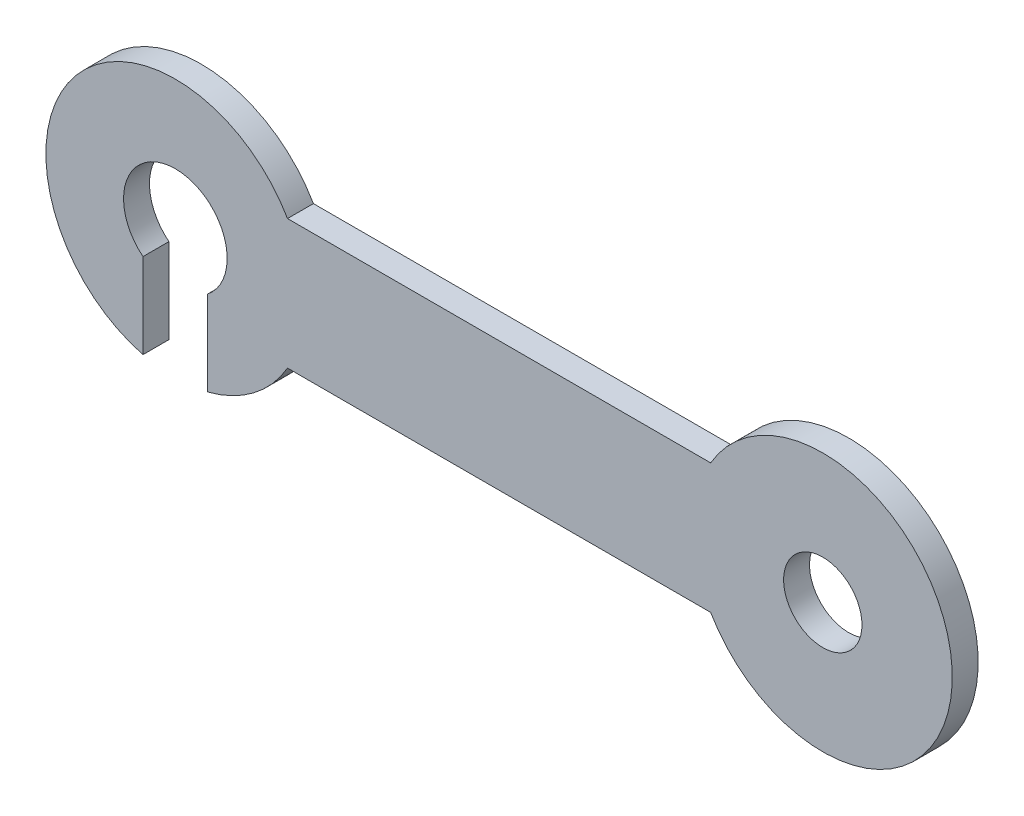
ISO-10303-21;
HEADER;
FILE_DESCRIPTION(('STEP AP214'),'2;1');
FILE_NAME('part.step','',(''),(''),'','','');
FILE_SCHEMA(('AUTOMOTIVE_DESIGN { 1 0 10303 214 1 1 1 1 }'));
ENDSEC;
DATA;
#1=APPLICATION_CONTEXT('core data for automotive mechanical design processes');
#2=APPLICATION_PROTOCOL_DEFINITION('international standard','automotive_design',2000,#1);
#3=PRODUCT_CONTEXT('',#1,'mechanical');
#4=PRODUCT('Part','Part','',(#3));
#5=PRODUCT_RELATED_PRODUCT_CATEGORY('part','',(#4));
#6=PRODUCT_DEFINITION_FORMATION('','',#4);
#7=PRODUCT_DEFINITION_CONTEXT('part definition',#1,'design');
#8=PRODUCT_DEFINITION('design','',#6,#7);
#9=PRODUCT_DEFINITION_SHAPE('','',#8);
#10=(LENGTH_UNIT() NAMED_UNIT(*) SI_UNIT(.MILLI.,.METRE.));
#11=(NAMED_UNIT(*) PLANE_ANGLE_UNIT() SI_UNIT($,.RADIAN.));
#12=(NAMED_UNIT(*) SI_UNIT($,.STERADIAN.) SOLID_ANGLE_UNIT());
#13=UNCERTAINTY_MEASURE_WITH_UNIT(LENGTH_MEASURE(1.E-05),#10,'distance_accuracy_value','');
#14=(GEOMETRIC_REPRESENTATION_CONTEXT(3) GLOBAL_UNCERTAINTY_ASSIGNED_CONTEXT((#13)) GLOBAL_UNIT_ASSIGNED_CONTEXT((#10,
#11,#12)) REPRESENTATION_CONTEXT('',''));
#15=CARTESIAN_POINT('',(0.,0.,0.));
#16=DIRECTION('',(0.,0.,1.));
#17=DIRECTION('',(1.,0.,0.));
#18=AXIS2_PLACEMENT_3D('',#15,#16,#17);
#19=CARTESIAN_POINT('',(0.,0.,4.));
#20=DIRECTION('',(0.,0.,-1.));
#21=DIRECTION('',(-1.,0.,0.));
#22=AXIS2_PLACEMENT_3D('',#19,#20,#21);
#23=CYLINDRICAL_SURFACE('',#22,20.);
#24=DIRECTION('',(0.,0.,-1.));
#25=VECTOR('',#24,1.);
#26=CARTESIAN_POINT('',(5.,-19.3649167310371,4.));
#27=LINE('',#26,#25);
#28=CARTESIAN_POINT('',(5.,-19.3649167310371,0.));
#29=VERTEX_POINT('',#28);
#30=CARTESIAN_POINT('',(5.,-19.3649167310371,4.));
#31=VERTEX_POINT('',#30);
#32=EDGE_CURVE('E99',#29,#31,#27,.F.);
#33=ORIENTED_EDGE('',*,*,#32,.F.);
#34=CARTESIAN_POINT('',(0.,0.,0.));
#35=DIRECTION('',(0.,0.,1.));
#36=DIRECTION('',(1.,0.,0.));
#37=AXIS2_PLACEMENT_3D('',#34,#35,#36);
#38=CIRCLE('',#37,20.);
#39=CARTESIAN_POINT('',(17.3205080756888,-10.,0.));
#40=VERTEX_POINT('',#39);
#41=EDGE_CURVE('E109',#29,#40,#38,.T.);
#42=ORIENTED_EDGE('',*,*,#41,.T.);
#43=DIRECTION('',(0.,0.,-1.));
#44=VECTOR('',#43,1.);
#45=CARTESIAN_POINT('',(17.3205080756888,-10.,4.));
#46=LINE('',#45,#44);
#47=CARTESIAN_POINT('',(17.3205080756888,-10.,4.));
#48=VERTEX_POINT('',#47);
#49=EDGE_CURVE('E124',#48,#40,#46,.T.);
#50=ORIENTED_EDGE('',*,*,#49,.F.);
#51=CARTESIAN_POINT('',(0.,0.,4.));
#52=DIRECTION('',(0.,0.,1.));
#53=DIRECTION('',(1.,0.,0.));
#54=AXIS2_PLACEMENT_3D('',#51,#52,#53);
#55=CIRCLE('',#54,20.);
#56=EDGE_CURVE('E111',#31,#48,#55,.T.);
#57=ORIENTED_EDGE('',*,*,#56,.F.);
#58=EDGE_LOOP('',(#33,#42,#50,#57));
#59=FACE_BOUND('',#58,.T.);
#60=ADVANCED_FACE('F35',(#59),#23,.T.);
#61=DIRECTION('',(0.,0.,-1.));
#62=VECTOR('',#61,1.);
#63=CARTESIAN_POINT('',(-5.,-19.3649167310371,4.));
#64=LINE('',#63,#62);
#65=CARTESIAN_POINT('',(-5.,-19.3649167310371,4.));
#66=VERTEX_POINT('',#65);
#67=CARTESIAN_POINT('',(-5.,-19.3649167310371,0.));
#68=VERTEX_POINT('',#67);
#69=EDGE_CURVE('E113',#66,#68,#64,.T.);
#70=ORIENTED_EDGE('',*,*,#69,.F.);
#71=CARTESIAN_POINT('',(17.3205080756888,10.,4.));
#72=VERTEX_POINT('',#71);
#73=EDGE_CURVE('E127',#72,#66,#55,.T.);
#74=ORIENTED_EDGE('',*,*,#73,.F.);
#75=DIRECTION('',(0.,0.,-1.));
#76=VECTOR('',#75,1.);
#77=CARTESIAN_POINT('',(17.3205080756888,10.,4.));
#78=LINE('',#77,#76);
#79=CARTESIAN_POINT('',(17.3205080756888,10.,0.));
#80=VERTEX_POINT('',#79);
#81=EDGE_CURVE('E120',#80,#72,#78,.F.);
#82=ORIENTED_EDGE('',*,*,#81,.F.);
#83=EDGE_CURVE('E119',#80,#68,#38,.T.);
#84=ORIENTED_EDGE('',*,*,#83,.T.);
#85=EDGE_LOOP('',(#70,#74,#82,#84));
#86=FACE_BOUND('',#85,.T.);
#87=ADVANCED_FACE('F171',(#86),#23,.T.);
#88=CARTESIAN_POINT('',(0.,0.,4.));
#89=DIRECTION('',(0.,0.,1.));
#90=DIRECTION('',(1.,0.,0.));
#91=AXIS2_PLACEMENT_3D('',#88,#89,#90);
#92=PLANE('',#91);
#93=CARTESIAN_POINT('',(100.,0.,4.));
#94=DIRECTION('',(0.,0.,1.));
#95=DIRECTION('',(1.,0.,0.));
#96=AXIS2_PLACEMENT_3D('',#93,#94,#95);
#97=CIRCLE('',#96,6.05);
#98=CARTESIAN_POINT('',(106.05,0.,4.));
#99=VERTEX_POINT('',#98);
#100=EDGE_CURVE('E104',#99,#99,#97,.T.);
#101=ORIENTED_EDGE('',*,*,#100,.F.);
#102=EDGE_LOOP('',(#101));
#103=FACE_BOUND('',#102,.T.);
#104=CARTESIAN_POINT('',(0.,0.,4.));
#105=DIRECTION('',(0.,0.,1.));
#106=DIRECTION('',(1.,0.,0.));
#107=AXIS2_PLACEMENT_3D('',#104,#105,#106);
#108=CIRCLE('',#107,8.);
#109=CARTESIAN_POINT('',(5.,-6.2449979983984,4.));
#110=VERTEX_POINT('',#109);
#111=CARTESIAN_POINT('',(-5.,-6.2449979983984,4.));
#112=VERTEX_POINT('',#111);
#113=EDGE_CURVE('E158',#110,#112,#108,.T.);
#114=ORIENTED_EDGE('',*,*,#113,.F.);
#115=DIRECTION('',(0.,1.,0.));
#116=VECTOR('',#115,1.);
#117=CARTESIAN_POINT('',(5.,-23.9724249305707,4.));
#118=LINE('',#117,#116);
#119=EDGE_CURVE('E57',#31,#110,#118,.T.);
#120=ORIENTED_EDGE('',*,*,#119,.F.);
#121=ORIENTED_EDGE('',*,*,#56,.T.);
#122=DIRECTION('',(1.,0.,0.));
#123=VECTOR('',#122,1.);
#124=CARTESIAN_POINT('',(0.,-10.,4.));
#125=LINE('',#124,#123);
#126=CARTESIAN_POINT('',(82.6794919243112,-10.,4.));
#127=VERTEX_POINT('',#126);
#128=EDGE_CURVE('E138',#48,#127,#125,.T.);
#129=ORIENTED_EDGE('',*,*,#128,.T.);
#130=CARTESIAN_POINT('',(100.,0.,4.));
#131=DIRECTION('',(0.,0.,1.));
#132=DIRECTION('',(1.,0.,0.));
#133=AXIS2_PLACEMENT_3D('',#130,#131,#132);
#134=CIRCLE('',#133,20.);
#135=CARTESIAN_POINT('',(82.6794919243112,10.,4.));
#136=VERTEX_POINT('',#135);
#137=EDGE_CURVE('E150',#127,#136,#134,.T.);
#138=ORIENTED_EDGE('',*,*,#137,.T.);
#139=DIRECTION('',(-1.,0.,0.));
#140=VECTOR('',#139,1.);
#141=CARTESIAN_POINT('',(0.,10.,4.));
#142=LINE('',#141,#140);
#143=EDGE_CURVE('E147',#136,#72,#142,.T.);
#144=ORIENTED_EDGE('',*,*,#143,.T.);
#145=ORIENTED_EDGE('',*,*,#73,.T.);
#146=DIRECTION('',(0.,-1.,0.));
#147=VECTOR('',#146,1.);
#148=CARTESIAN_POINT('',(-5.,-23.9724249305707,4.));
#149=LINE('',#148,#147);
#150=EDGE_CURVE('E176',#112,#66,#149,.T.);
#151=ORIENTED_EDGE('',*,*,#150,.F.);
#152=EDGE_LOOP('',(#114,#120,#121,#129,#138,#144,#145,#151));
#153=FACE_BOUND('',#152,.T.);
#154=ADVANCED_FACE('F135',(#103,#153),#92,.T.);
#155=CARTESIAN_POINT('',(0.,0.,0.));
#156=DIRECTION('',(0.,0.,1.));
#157=DIRECTION('',(1.,0.,0.));
#158=AXIS2_PLACEMENT_3D('',#155,#156,#157);
#159=PLANE('',#158);
#160=CARTESIAN_POINT('',(100.,0.,0.));
#161=DIRECTION('',(0.,0.,1.));
#162=DIRECTION('',(1.,0.,0.));
#163=AXIS2_PLACEMENT_3D('',#160,#161,#162);
#164=CIRCLE('',#163,6.05);
#165=CARTESIAN_POINT('',(106.05,0.,0.));
#166=VERTEX_POINT('',#165);
#167=EDGE_CURVE('E180',#166,#166,#164,.T.);
#168=ORIENTED_EDGE('',*,*,#167,.T.);
#169=EDGE_LOOP('',(#168));
#170=FACE_BOUND('',#169,.T.);
#171=DIRECTION('',(0.,1.,0.));
#172=VECTOR('',#171,1.);
#173=CARTESIAN_POINT('',(5.,-23.9724249305707,0.));
#174=LINE('',#173,#172);
#175=CARTESIAN_POINT('',(5.,-6.2449979983984,0.));
#176=VERTEX_POINT('',#175);
#177=EDGE_CURVE('E96',#29,#176,#174,.T.);
#178=ORIENTED_EDGE('',*,*,#177,.T.);
#179=CARTESIAN_POINT('',(0.,0.,0.));
#180=DIRECTION('',(0.,0.,1.));
#181=DIRECTION('',(1.,0.,0.));
#182=AXIS2_PLACEMENT_3D('',#179,#180,#181);
#183=CIRCLE('',#182,8.);
#184=CARTESIAN_POINT('',(-5.,-6.2449979983984,0.));
#185=VERTEX_POINT('',#184);
#186=EDGE_CURVE('E112',#176,#185,#183,.T.);
#187=ORIENTED_EDGE('',*,*,#186,.T.);
#188=DIRECTION('',(0.,-1.,0.));
#189=VECTOR('',#188,1.);
#190=CARTESIAN_POINT('',(-5.,-23.9724249305707,0.));
#191=LINE('',#190,#189);
#192=EDGE_CURVE('E49',#185,#68,#191,.T.);
#193=ORIENTED_EDGE('',*,*,#192,.T.);
#194=ORIENTED_EDGE('',*,*,#83,.F.);
#195=DIRECTION('',(-1.,0.,0.));
#196=VECTOR('',#195,1.);
#197=CARTESIAN_POINT('',(0.,10.,0.));
#198=LINE('',#197,#196);
#199=CARTESIAN_POINT('',(82.6794919243112,10.,0.));
#200=VERTEX_POINT('',#199);
#201=EDGE_CURVE('E157',#200,#80,#198,.T.);
#202=ORIENTED_EDGE('',*,*,#201,.F.);
#203=CARTESIAN_POINT('',(100.,0.,0.));
#204=DIRECTION('',(0.,0.,1.));
#205=DIRECTION('',(1.,0.,0.));
#206=AXIS2_PLACEMENT_3D('',#203,#204,#205);
#207=CIRCLE('',#206,20.);
#208=CARTESIAN_POINT('',(82.6794919243112,-10.,0.));
#209=VERTEX_POINT('',#208);
#210=EDGE_CURVE('E154',#209,#200,#207,.T.);
#211=ORIENTED_EDGE('',*,*,#210,.F.);
#212=DIRECTION('',(1.,0.,0.));
#213=VECTOR('',#212,1.);
#214=CARTESIAN_POINT('',(0.,-10.,0.));
#215=LINE('',#214,#213);
#216=EDGE_CURVE('E118',#40,#209,#215,.T.);
#217=ORIENTED_EDGE('',*,*,#216,.F.);
#218=ORIENTED_EDGE('',*,*,#41,.F.);
#219=EDGE_LOOP('',(#178,#187,#193,#194,#202,#211,#217,#218));
#220=FACE_BOUND('',#219,.T.);
#221=ADVANCED_FACE('F116',(#170,#220),#159,.F.);
#222=CARTESIAN_POINT('',(0.,0.,4.));
#223=DIRECTION('',(0.,0.,-1.));
#224=DIRECTION('',(-1.,0.,0.));
#225=AXIS2_PLACEMENT_3D('',#222,#223,#224);
#226=CYLINDRICAL_SURFACE('',#225,8.);
#227=ORIENTED_EDGE('',*,*,#186,.F.);
#228=DIRECTION('',(0.,0.,-1.));
#229=VECTOR('',#228,1.);
#230=CARTESIAN_POINT('',(5.,-6.2449979983984,4.));
#231=LINE('',#230,#229);
#232=EDGE_CURVE('E11',#176,#110,#231,.F.);
#233=ORIENTED_EDGE('',*,*,#232,.T.);
#234=ORIENTED_EDGE('',*,*,#113,.T.);
#235=DIRECTION('',(0.,0.,-1.));
#236=VECTOR('',#235,1.);
#237=CARTESIAN_POINT('',(-5.,-6.2449979983984,4.));
#238=LINE('',#237,#236);
#239=EDGE_CURVE('E42',#112,#185,#238,.T.);
#240=ORIENTED_EDGE('',*,*,#239,.T.);
#241=EDGE_LOOP('',(#227,#233,#234,#240));
#242=FACE_BOUND('',#241,.T.);
#243=ADVANCED_FACE('F195',(#242),#226,.F.);
#244=CARTESIAN_POINT('',(0.,10.,4.));
#245=DIRECTION('',(0.,-1.,0.));
#246=DIRECTION('',(1.,0.,0.));
#247=AXIS2_PLACEMENT_3D('',#244,#245,#246);
#248=PLANE('',#247);
#249=ORIENTED_EDGE('',*,*,#201,.T.);
#250=ORIENTED_EDGE('',*,*,#81,.T.);
#251=ORIENTED_EDGE('',*,*,#143,.F.);
#252=DIRECTION('',(0.,0.,-1.));
#253=VECTOR('',#252,1.);
#254=CARTESIAN_POINT('',(82.6794919243112,10.,4.));
#255=LINE('',#254,#253);
#256=EDGE_CURVE('E141',#136,#200,#255,.T.);
#257=ORIENTED_EDGE('',*,*,#256,.T.);
#258=EDGE_LOOP('',(#249,#250,#251,#257));
#259=FACE_BOUND('',#258,.T.);
#260=ADVANCED_FACE('F165',(#259),#248,.F.);
#261=CARTESIAN_POINT('',(0.,-10.,4.));
#262=DIRECTION('',(0.,1.,0.));
#263=DIRECTION('',(0.,0.,1.));
#264=AXIS2_PLACEMENT_3D('',#261,#262,#263);
#265=PLANE('',#264);
#266=ORIENTED_EDGE('',*,*,#128,.F.);
#267=ORIENTED_EDGE('',*,*,#49,.T.);
#268=ORIENTED_EDGE('',*,*,#216,.T.);
#269=DIRECTION('',(0.,0.,-1.));
#270=VECTOR('',#269,1.);
#271=CARTESIAN_POINT('',(82.6794919243112,-10.,4.));
#272=LINE('',#271,#270);
#273=EDGE_CURVE('E145',#127,#209,#272,.T.);
#274=ORIENTED_EDGE('',*,*,#273,.F.);
#275=EDGE_LOOP('',(#266,#267,#268,#274));
#276=FACE_BOUND('',#275,.T.);
#277=ADVANCED_FACE('F143',(#276),#265,.F.);
#278=CARTESIAN_POINT('',(100.,0.,4.));
#279=DIRECTION('',(0.,0.,-1.));
#280=DIRECTION('',(-1.,0.,0.));
#281=AXIS2_PLACEMENT_3D('',#278,#279,#280);
#282=CYLINDRICAL_SURFACE('',#281,20.);
#283=ORIENTED_EDGE('',*,*,#210,.T.);
#284=ORIENTED_EDGE('',*,*,#256,.F.);
#285=ORIENTED_EDGE('',*,*,#137,.F.);
#286=ORIENTED_EDGE('',*,*,#273,.T.);
#287=EDGE_LOOP('',(#283,#284,#285,#286));
#288=FACE_BOUND('',#287,.T.);
#289=ADVANCED_FACE('F167',(#288),#282,.T.);
#290=CARTESIAN_POINT('',(-5.,-23.9724249305707,4.));
#291=DIRECTION('',(1.,0.,0.));
#292=DIRECTION('',(0.,0.,-1.));
#293=AXIS2_PLACEMENT_3D('',#290,#291,#292);
#294=PLANE('',#293);
#295=ORIENTED_EDGE('',*,*,#69,.T.);
#296=ORIENTED_EDGE('',*,*,#192,.F.);
#297=ORIENTED_EDGE('',*,*,#239,.F.);
#298=ORIENTED_EDGE('',*,*,#150,.T.);
#299=EDGE_LOOP('',(#295,#296,#297,#298));
#300=FACE_BOUND('',#299,.T.);
#301=ADVANCED_FACE('F245',(#300),#294,.T.);
#302=CARTESIAN_POINT('',(5.,-23.9724249305707,4.));
#303=DIRECTION('',(-1.,0.,0.));
#304=DIRECTION('',(0.,0.,1.));
#305=AXIS2_PLACEMENT_3D('',#302,#303,#304);
#306=PLANE('',#305);
#307=ORIENTED_EDGE('',*,*,#32,.T.);
#308=ORIENTED_EDGE('',*,*,#119,.T.);
#309=ORIENTED_EDGE('',*,*,#232,.F.);
#310=ORIENTED_EDGE('',*,*,#177,.F.);
#311=EDGE_LOOP('',(#307,#308,#309,#310));
#312=FACE_BOUND('',#311,.T.);
#313=ADVANCED_FACE('F98',(#312),#306,.T.);
#314=CARTESIAN_POINT('',(100.,0.,4.));
#315=DIRECTION('',(0.,0.,-1.));
#316=DIRECTION('',(-1.,0.,0.));
#317=AXIS2_PLACEMENT_3D('',#314,#315,#316);
#318=CYLINDRICAL_SURFACE('',#317,6.05);
#319=ORIENTED_EDGE('',*,*,#100,.T.);
#320=EDGE_LOOP('',(#319));
#321=FACE_BOUND('',#320,.T.);
#322=ORIENTED_EDGE('',*,*,#167,.F.);
#323=EDGE_LOOP('',(#322));
#324=FACE_BOUND('',#323,.T.);
#325=ADVANCED_FACE('F186',(#321,#324),#318,.F.);
#326=CLOSED_SHELL('',(#60,#87,#154,#221,#243,#260,#277,#289,#301,#313,#325));
#327=MANIFOLD_SOLID_BREP('B2',#326);
#328=ADVANCED_BREP_SHAPE_REPRESENTATION('',(#18,#327),#14);
#329=SHAPE_DEFINITION_REPRESENTATION(#9,#328);
ENDSEC;
END-ISO-10303-21;
